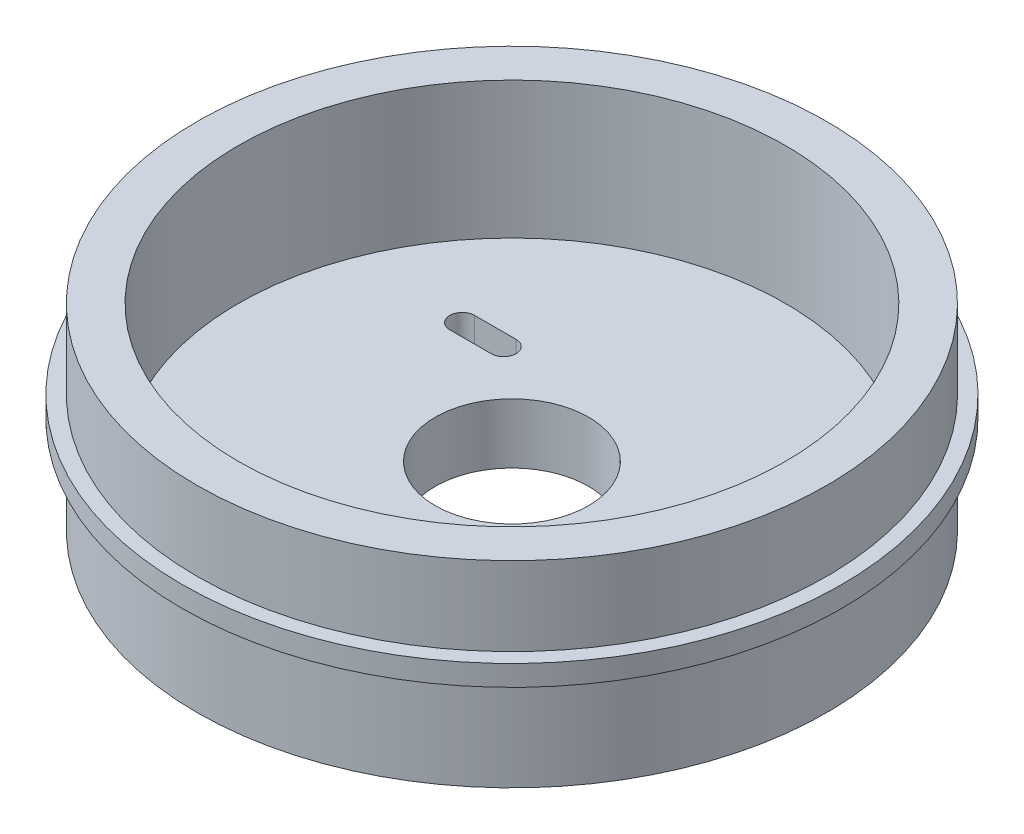
ISO-10303-21;
HEADER;
FILE_DESCRIPTION(('STEP AP214'),'2;1');
FILE_NAME('part.step','',(''),(''),'','','');
FILE_SCHEMA(('AUTOMOTIVE_DESIGN { 1 0 10303 214 1 1 1 1 }'));
ENDSEC;
DATA;
#1=APPLICATION_CONTEXT('core data for automotive mechanical design processes');
#2=APPLICATION_PROTOCOL_DEFINITION('international standard','automotive_design',2000,#1);
#3=PRODUCT_CONTEXT('',#1,'mechanical');
#4=PRODUCT('Part','Part','',(#3));
#5=PRODUCT_RELATED_PRODUCT_CATEGORY('part','',(#4));
#6=PRODUCT_DEFINITION_FORMATION('','',#4);
#7=PRODUCT_DEFINITION_CONTEXT('part definition',#1,'design');
#8=PRODUCT_DEFINITION('design','',#6,#7);
#9=PRODUCT_DEFINITION_SHAPE('','',#8);
#10=(LENGTH_UNIT() NAMED_UNIT(*) SI_UNIT(.MILLI.,.METRE.));
#11=(NAMED_UNIT(*) PLANE_ANGLE_UNIT() SI_UNIT($,.RADIAN.));
#12=(NAMED_UNIT(*) SI_UNIT($,.STERADIAN.) SOLID_ANGLE_UNIT());
#13=UNCERTAINTY_MEASURE_WITH_UNIT(LENGTH_MEASURE(1.E-05),#10,'distance_accuracy_value','');
#14=(GEOMETRIC_REPRESENTATION_CONTEXT(3) GLOBAL_UNCERTAINTY_ASSIGNED_CONTEXT((#13)) GLOBAL_UNIT_ASSIGNED_CONTEXT((#10,
#11,#12)) REPRESENTATION_CONTEXT('',''));
#15=CARTESIAN_POINT('',(0.,0.,0.));
#16=DIRECTION('',(0.,0.,1.));
#17=DIRECTION('',(1.,0.,0.));
#18=AXIS2_PLACEMENT_3D('',#15,#16,#17);
#19=CARTESIAN_POINT('',(0.,101.923076923077,0.));
#20=DIRECTION('',(0.,1.,0.));
#21=DIRECTION('',(0.,0.,1.));
#22=AXIS2_PLACEMENT_3D('',#19,#20,#21);
#23=CYLINDRICAL_SURFACE('',#22,76.);
#24=CARTESIAN_POINT('',(0.,0.,0.));
#25=DIRECTION('',(0.,1.,0.));
#26=DIRECTION('',(0.,0.,1.));
#27=AXIS2_PLACEMENT_3D('',#24,#25,#26);
#28=CIRCLE('',#27,76.);
#29=CARTESIAN_POINT('',(0.,0.,76.));
#30=VERTEX_POINT('',#29);
#31=EDGE_CURVE('E11',#30,#30,#28,.T.);
#32=ORIENTED_EDGE('',*,*,#31,.T.);
#33=EDGE_LOOP('',(#32));
#34=FACE_BOUND('',#33,.T.);
#35=CARTESIAN_POINT('',(0.,23.4615384615384,0.));
#36=DIRECTION('',(0.,1.,0.));
#37=DIRECTION('',(0.,0.,1.));
#38=AXIS2_PLACEMENT_3D('',#35,#36,#37);
#39=CIRCLE('',#38,76.);
#40=CARTESIAN_POINT('',(0.,23.4615384615384,76.));
#41=VERTEX_POINT('',#40);
#42=EDGE_CURVE('E109',#41,#41,#39,.T.);
#43=ORIENTED_EDGE('',*,*,#42,.F.);
#44=EDGE_LOOP('',(#43));
#45=FACE_BOUND('',#44,.T.);
#46=ADVANCED_FACE('F34',(#34,#45),#23,.T.);
#47=CARTESIAN_POINT('',(-76.,0.,0.));
#48=DIRECTION('',(0.,-1.,0.));
#49=DIRECTION('',(0.,0.,-1.));
#50=AXIS2_PLACEMENT_3D('',#47,#48,#49);
#51=PLANE('',#50);
#52=CARTESIAN_POINT('',(-35.,0.,-23.));
#53=DIRECTION('',(0.,-1.,0.));
#54=DIRECTION('',(0.,0.,-1.));
#55=AXIS2_PLACEMENT_3D('',#52,#53,#54);
#56=CIRCLE('',#55,3.);
#57=CARTESIAN_POINT('',(-35.,0.,-26.));
#58=VERTEX_POINT('',#57);
#59=CARTESIAN_POINT('',(-35.,0.,-20.));
#60=VERTEX_POINT('',#59);
#61=EDGE_CURVE('E101',#58,#60,#56,.F.);
#62=ORIENTED_EDGE('',*,*,#61,.T.);
#63=DIRECTION('',(1.,0.,0.));
#64=VECTOR('',#63,1.);
#65=CARTESIAN_POINT('',(-35.,0.,-20.));
#66=LINE('',#65,#64);
#67=CARTESIAN_POINT('',(-25.,0.,-20.));
#68=VERTEX_POINT('',#67);
#69=EDGE_CURVE('E76',#60,#68,#66,.T.);
#70=ORIENTED_EDGE('',*,*,#69,.T.);
#71=CARTESIAN_POINT('',(-25.,0.,-23.));
#72=DIRECTION('',(0.,-1.,0.));
#73=DIRECTION('',(0.,0.,-1.));
#74=AXIS2_PLACEMENT_3D('',#71,#72,#73);
#75=CIRCLE('',#74,3.);
#76=CARTESIAN_POINT('',(-25.,0.,-26.));
#77=VERTEX_POINT('',#76);
#78=EDGE_CURVE('E85',#68,#77,#75,.F.);
#79=ORIENTED_EDGE('',*,*,#78,.T.);
#80=DIRECTION('',(1.,0.,0.));
#81=VECTOR('',#80,1.);
#82=CARTESIAN_POINT('',(-35.,0.,-26.));
#83=LINE('',#82,#81);
#84=EDGE_CURVE('E99',#58,#77,#83,.T.);
#85=ORIENTED_EDGE('',*,*,#84,.F.);
#86=EDGE_LOOP('',(#62,#70,#79,#85));
#87=FACE_BOUND('',#86,.T.);
#88=CARTESIAN_POINT('',(0.,0.,0.));
#89=DIRECTION('',(0.,1.,0.));
#90=DIRECTION('',(0.,0.,1.));
#91=AXIS2_PLACEMENT_3D('',#88,#89,#90);
#92=CIRCLE('',#91,18.5);
#93=CARTESIAN_POINT('',(0.,0.,18.5));
#94=VERTEX_POINT('',#93);
#95=EDGE_CURVE('E41',#94,#94,#92,.T.);
#96=ORIENTED_EDGE('',*,*,#95,.T.);
#97=EDGE_LOOP('',(#96));
#98=FACE_BOUND('',#97,.T.);
#99=ORIENTED_EDGE('',*,*,#31,.F.);
#100=EDGE_LOOP('',(#99));
#101=FACE_BOUND('',#100,.T.);
#102=ADVANCED_FACE('F135',(#87,#98,#101),#51,.T.);
#103=CARTESIAN_POINT('',(0.,101.923076923077,0.));
#104=DIRECTION('',(0.,1.,0.));
#105=DIRECTION('',(0.,0.,1.));
#106=AXIS2_PLACEMENT_3D('',#103,#104,#105);
#107=CYLINDRICAL_SURFACE('',#106,18.5);
#108=CARTESIAN_POINT('',(0.,14.4615384615384,0.));
#109=DIRECTION('',(0.,1.,0.));
#110=DIRECTION('',(0.,0.,1.));
#111=AXIS2_PLACEMENT_3D('',#108,#109,#110);
#112=CIRCLE('',#111,18.5);
#113=CARTESIAN_POINT('',(0.,14.4615384615384,18.5));
#114=VERTEX_POINT('',#113);
#115=EDGE_CURVE('E130',#114,#114,#112,.T.);
#116=ORIENTED_EDGE('',*,*,#115,.T.);
#117=EDGE_LOOP('',(#116));
#118=FACE_BOUND('',#117,.T.);
#119=ORIENTED_EDGE('',*,*,#95,.F.);
#120=EDGE_LOOP('',(#119));
#121=FACE_BOUND('',#120,.T.);
#122=ADVANCED_FACE('F138',(#118,#121),#107,.F.);
#123=CARTESIAN_POINT('',(-18.5,14.4615384615384,0.));
#124=DIRECTION('',(0.,1.,0.));
#125=DIRECTION('',(0.,0.,1.));
#126=AXIS2_PLACEMENT_3D('',#123,#124,#125);
#127=PLANE('',#126);
#128=CARTESIAN_POINT('',(-35.,14.4615384615384,-23.));
#129=DIRECTION('',(0.,1.,0.));
#130=DIRECTION('',(0.,0.,1.));
#131=AXIS2_PLACEMENT_3D('',#128,#129,#130);
#132=CIRCLE('',#131,3.);
#133=CARTESIAN_POINT('',(-35.,14.4615384615384,-20.));
#134=VERTEX_POINT('',#133);
#135=CARTESIAN_POINT('',(-35.,14.4615384615384,-26.));
#136=VERTEX_POINT('',#135);
#137=EDGE_CURVE('E94',#134,#136,#132,.F.);
#138=ORIENTED_EDGE('',*,*,#137,.T.);
#139=DIRECTION('',(-1.,0.,0.));
#140=VECTOR('',#139,1.);
#141=CARTESIAN_POINT('',(-35.,14.4615384615384,-26.));
#142=LINE('',#141,#140);
#143=CARTESIAN_POINT('',(-25.,14.4615384615384,-26.));
#144=VERTEX_POINT('',#143);
#145=EDGE_CURVE('E92',#144,#136,#142,.T.);
#146=ORIENTED_EDGE('',*,*,#145,.F.);
#147=CARTESIAN_POINT('',(-25.,14.4615384615384,-23.));
#148=DIRECTION('',(0.,1.,0.));
#149=DIRECTION('',(0.,0.,1.));
#150=AXIS2_PLACEMENT_3D('',#147,#148,#149);
#151=CIRCLE('',#150,3.);
#152=CARTESIAN_POINT('',(-25.,14.4615384615384,-20.));
#153=VERTEX_POINT('',#152);
#154=EDGE_CURVE('E82',#144,#153,#151,.F.);
#155=ORIENTED_EDGE('',*,*,#154,.T.);
#156=DIRECTION('',(-1.,0.,0.));
#157=VECTOR('',#156,1.);
#158=CARTESIAN_POINT('',(-35.,14.4615384615384,-20.));
#159=LINE('',#158,#157);
#160=EDGE_CURVE('E71',#153,#134,#159,.T.);
#161=ORIENTED_EDGE('',*,*,#160,.T.);
#162=EDGE_LOOP('',(#138,#146,#155,#161));
#163=FACE_BOUND('',#162,.T.);
#164=CARTESIAN_POINT('',(0.,14.4615384615384,0.));
#165=DIRECTION('',(0.,1.,0.));
#166=DIRECTION('',(0.,0.,1.));
#167=AXIS2_PLACEMENT_3D('',#164,#165,#166);
#168=CIRCLE('',#167,66.);
#169=CARTESIAN_POINT('',(0.,14.4615384615384,66.));
#170=VERTEX_POINT('',#169);
#171=EDGE_CURVE('E127',#170,#170,#168,.T.);
#172=ORIENTED_EDGE('',*,*,#171,.T.);
#173=EDGE_LOOP('',(#172));
#174=FACE_BOUND('',#173,.T.);
#175=ORIENTED_EDGE('',*,*,#115,.F.);
#176=EDGE_LOOP('',(#175));
#177=FACE_BOUND('',#176,.T.);
#178=ADVANCED_FACE('F90',(#163,#174,#177),#127,.T.);
#179=CARTESIAN_POINT('',(0.,101.923076923077,0.));
#180=DIRECTION('',(0.,1.,0.));
#181=DIRECTION('',(0.,0.,1.));
#182=AXIS2_PLACEMENT_3D('',#179,#180,#181);
#183=CYLINDRICAL_SURFACE('',#182,66.);
#184=CARTESIAN_POINT('',(0.,47.4615384615384,0.));
#185=DIRECTION('',(0.,1.,0.));
#186=DIRECTION('',(0.,0.,1.));
#187=AXIS2_PLACEMENT_3D('',#184,#185,#186);
#188=CIRCLE('',#187,66.);
#189=CARTESIAN_POINT('',(0.,47.4615384615384,66.));
#190=VERTEX_POINT('',#189);
#191=EDGE_CURVE('E124',#190,#190,#188,.T.);
#192=ORIENTED_EDGE('',*,*,#191,.T.);
#193=EDGE_LOOP('',(#192));
#194=FACE_BOUND('',#193,.T.);
#195=ORIENTED_EDGE('',*,*,#171,.F.);
#196=EDGE_LOOP('',(#195));
#197=FACE_BOUND('',#196,.T.);
#198=ADVANCED_FACE('F147',(#194,#197),#183,.F.);
#199=CARTESIAN_POINT('',(-66.,47.4615384615384,0.));
#200=DIRECTION('',(0.,1.,0.));
#201=DIRECTION('',(0.,0.,1.));
#202=AXIS2_PLACEMENT_3D('',#199,#200,#201);
#203=PLANE('',#202);
#204=CARTESIAN_POINT('',(0.,47.4615384615384,0.));
#205=DIRECTION('',(0.,1.,0.));
#206=DIRECTION('',(0.,0.,1.));
#207=AXIS2_PLACEMENT_3D('',#204,#205,#206);
#208=CIRCLE('',#207,76.);
#209=CARTESIAN_POINT('',(0.,47.4615384615384,76.));
#210=VERTEX_POINT('',#209);
#211=EDGE_CURVE('E121',#210,#210,#208,.T.);
#212=ORIENTED_EDGE('',*,*,#211,.T.);
#213=EDGE_LOOP('',(#212));
#214=FACE_BOUND('',#213,.T.);
#215=ORIENTED_EDGE('',*,*,#191,.F.);
#216=EDGE_LOOP('',(#215));
#217=FACE_BOUND('',#216,.T.);
#218=ADVANCED_FACE('F181',(#214,#217),#203,.T.);
#219=CARTESIAN_POINT('',(0.,101.923076923077,0.));
#220=DIRECTION('',(0.,1.,0.));
#221=DIRECTION('',(0.,0.,1.));
#222=AXIS2_PLACEMENT_3D('',#219,#220,#221);
#223=CYLINDRICAL_SURFACE('',#222,76.);
#224=CARTESIAN_POINT('',(0.,28.4615384615384,0.));
#225=DIRECTION('',(0.,1.,0.));
#226=DIRECTION('',(0.,0.,1.));
#227=AXIS2_PLACEMENT_3D('',#224,#225,#226);
#228=CIRCLE('',#227,76.);
#229=CARTESIAN_POINT('',(0.,28.4615384615384,76.));
#230=VERTEX_POINT('',#229);
#231=EDGE_CURVE('E118',#230,#230,#228,.T.);
#232=ORIENTED_EDGE('',*,*,#231,.T.);
#233=EDGE_LOOP('',(#232));
#234=FACE_BOUND('',#233,.T.);
#235=ORIENTED_EDGE('',*,*,#211,.F.);
#236=EDGE_LOOP('',(#235));
#237=FACE_BOUND('',#236,.T.);
#238=ADVANCED_FACE('F175',(#234,#237),#223,.T.);
#239=CARTESIAN_POINT('',(-76.,28.4615384615384,0.));
#240=DIRECTION('',(0.,1.,0.));
#241=DIRECTION('',(0.,0.,1.));
#242=AXIS2_PLACEMENT_3D('',#239,#240,#241);
#243=PLANE('',#242);
#244=CARTESIAN_POINT('',(0.,28.4615384615384,0.));
#245=DIRECTION('',(0.,1.,0.));
#246=DIRECTION('',(0.,0.,1.));
#247=AXIS2_PLACEMENT_3D('',#244,#245,#246);
#248=CIRCLE('',#247,79.5);
#249=CARTESIAN_POINT('',(0.,28.4615384615384,79.5));
#250=VERTEX_POINT('',#249);
#251=EDGE_CURVE('E115',#250,#250,#248,.T.);
#252=ORIENTED_EDGE('',*,*,#251,.T.);
#253=EDGE_LOOP('',(#252));
#254=FACE_BOUND('',#253,.T.);
#255=ORIENTED_EDGE('',*,*,#231,.F.);
#256=EDGE_LOOP('',(#255));
#257=FACE_BOUND('',#256,.T.);
#258=ADVANCED_FACE('F169',(#254,#257),#243,.T.);
#259=CARTESIAN_POINT('',(0.,101.923076923077,0.));
#260=DIRECTION('',(0.,1.,0.));
#261=DIRECTION('',(0.,0.,1.));
#262=AXIS2_PLACEMENT_3D('',#259,#260,#261);
#263=CYLINDRICAL_SURFACE('',#262,79.5);
#264=CARTESIAN_POINT('',(0.,23.4615384615384,0.));
#265=DIRECTION('',(0.,1.,0.));
#266=DIRECTION('',(0.,0.,1.));
#267=AXIS2_PLACEMENT_3D('',#264,#265,#266);
#268=CIRCLE('',#267,79.5);
#269=CARTESIAN_POINT('',(0.,23.4615384615384,79.5));
#270=VERTEX_POINT('',#269);
#271=EDGE_CURVE('E112',#270,#270,#268,.T.);
#272=ORIENTED_EDGE('',*,*,#271,.T.);
#273=EDGE_LOOP('',(#272));
#274=FACE_BOUND('',#273,.T.);
#275=ORIENTED_EDGE('',*,*,#251,.F.);
#276=EDGE_LOOP('',(#275));
#277=FACE_BOUND('',#276,.T.);
#278=ADVANCED_FACE('F163',(#274,#277),#263,.T.);
#279=CARTESIAN_POINT('',(-79.5,23.4615384615384,0.));
#280=DIRECTION('',(0.,-1.,0.));
#281=DIRECTION('',(0.,0.,-1.));
#282=AXIS2_PLACEMENT_3D('',#279,#280,#281);
#283=PLANE('',#282);
#284=ORIENTED_EDGE('',*,*,#42,.T.);
#285=EDGE_LOOP('',(#284));
#286=FACE_BOUND('',#285,.T.);
#287=ORIENTED_EDGE('',*,*,#271,.F.);
#288=EDGE_LOOP('',(#287));
#289=FACE_BOUND('',#288,.T.);
#290=ADVANCED_FACE('F159',(#286,#289),#283,.T.);
#291=CARTESIAN_POINT('',(-35.,-0.001000000000001,-23.));
#292=DIRECTION('',(0.,1.,0.));
#293=DIRECTION('',(0.,0.,1.));
#294=AXIS2_PLACEMENT_3D('',#291,#292,#293);
#295=CYLINDRICAL_SURFACE('',#294,3.);
#296=DIRECTION('',(0.,1.,0.));
#297=VECTOR('',#296,1.);
#298=CARTESIAN_POINT('',(-35.,-0.001000000000001,-26.));
#299=LINE('',#298,#297);
#300=EDGE_CURVE('E77',#58,#136,#299,.T.);
#301=ORIENTED_EDGE('',*,*,#300,.T.);
#302=ORIENTED_EDGE('',*,*,#137,.F.);
#303=DIRECTION('',(0.,1.,0.));
#304=VECTOR('',#303,1.);
#305=CARTESIAN_POINT('',(-35.,-0.001000000000001,-20.));
#306=LINE('',#305,#304);
#307=EDGE_CURVE('E53',#60,#134,#306,.T.);
#308=ORIENTED_EDGE('',*,*,#307,.F.);
#309=ORIENTED_EDGE('',*,*,#61,.F.);
#310=EDGE_LOOP('',(#301,#302,#308,#309));
#311=FACE_BOUND('',#310,.T.);
#312=ADVANCED_FACE('F162',(#311),#295,.F.);
#313=CARTESIAN_POINT('',(-35.,-0.001000000000001,-26.));
#314=DIRECTION('',(0.,0.,1.));
#315=DIRECTION('',(1.,0.,0.));
#316=AXIS2_PLACEMENT_3D('',#313,#314,#315);
#317=PLANE('',#316);
#318=ORIENTED_EDGE('',*,*,#84,.T.);
#319=DIRECTION('',(0.,1.,0.));
#320=VECTOR('',#319,1.);
#321=CARTESIAN_POINT('',(-25.,-0.001000000000001,-26.));
#322=LINE('',#321,#320);
#323=EDGE_CURVE('E87',#77,#144,#322,.T.);
#324=ORIENTED_EDGE('',*,*,#323,.T.);
#325=ORIENTED_EDGE('',*,*,#145,.T.);
#326=ORIENTED_EDGE('',*,*,#300,.F.);
#327=EDGE_LOOP('',(#318,#324,#325,#326));
#328=FACE_BOUND('',#327,.T.);
#329=ADVANCED_FACE('F201',(#328),#317,.T.);
#330=CARTESIAN_POINT('',(-25.,-0.001000000000001,-23.));
#331=DIRECTION('',(0.,1.,0.));
#332=DIRECTION('',(0.,0.,1.));
#333=AXIS2_PLACEMENT_3D('',#330,#331,#332);
#334=CYLINDRICAL_SURFACE('',#333,3.);
#335=DIRECTION('',(0.,1.,0.));
#336=VECTOR('',#335,1.);
#337=CARTESIAN_POINT('',(-25.,-0.001000000000001,-20.));
#338=LINE('',#337,#336);
#339=EDGE_CURVE('E48',#68,#153,#338,.T.);
#340=ORIENTED_EDGE('',*,*,#339,.T.);
#341=ORIENTED_EDGE('',*,*,#154,.F.);
#342=ORIENTED_EDGE('',*,*,#323,.F.);
#343=ORIENTED_EDGE('',*,*,#78,.F.);
#344=EDGE_LOOP('',(#340,#341,#342,#343));
#345=FACE_BOUND('',#344,.T.);
#346=ADVANCED_FACE('F80',(#345),#334,.F.);
#347=CARTESIAN_POINT('',(-35.,-0.001000000000001,-20.));
#348=DIRECTION('',(0.,0.,1.));
#349=DIRECTION('',(1.,0.,0.));
#350=AXIS2_PLACEMENT_3D('',#347,#348,#349);
#351=PLANE('',#350);
#352=ORIENTED_EDGE('',*,*,#307,.T.);
#353=ORIENTED_EDGE('',*,*,#160,.F.);
#354=ORIENTED_EDGE('',*,*,#339,.F.);
#355=ORIENTED_EDGE('',*,*,#69,.F.);
#356=EDGE_LOOP('',(#352,#353,#354,#355));
#357=FACE_BOUND('',#356,.T.);
#358=ADVANCED_FACE('F72',(#357),#351,.F.);
#359=CLOSED_SHELL('',(#46,#102,#122,#178,#198,#218,#238,#258,#278,#290,#312,#329,#346,#358));
#360=MANIFOLD_SOLID_BREP('B2',#359);
#361=ADVANCED_BREP_SHAPE_REPRESENTATION('',(#18,#360),#14);
#362=SHAPE_DEFINITION_REPRESENTATION(#9,#361);
ENDSEC;
END-ISO-10303-21;
